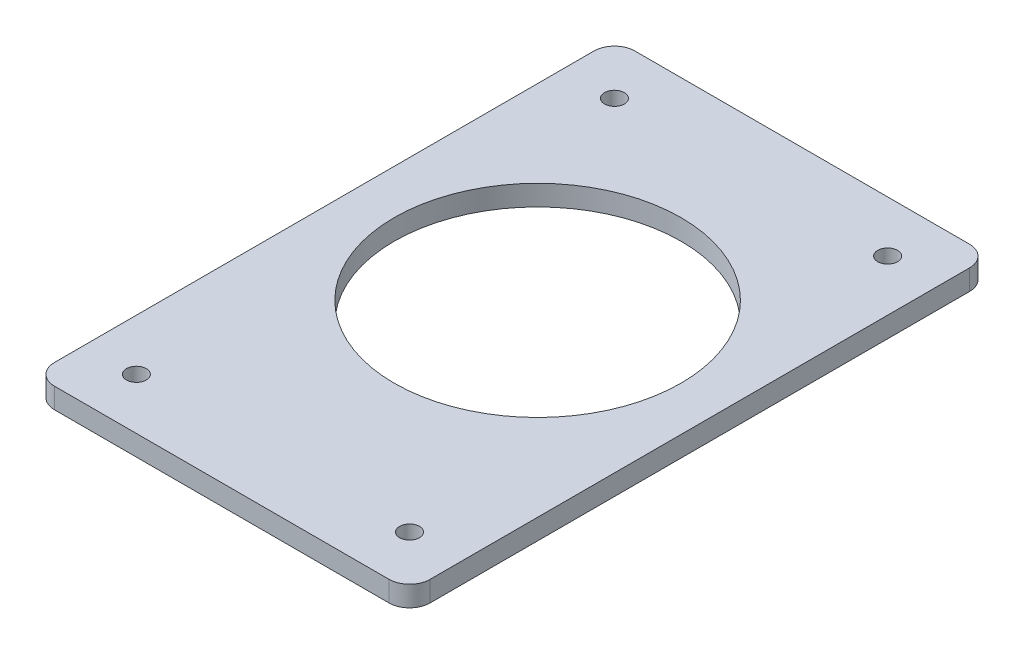
ISO-10303-21;
HEADER;
FILE_DESCRIPTION(('STEP AP214'),'2;1');
FILE_NAME('part.step','',(''),(''),'','','');
FILE_SCHEMA(('AUTOMOTIVE_DESIGN { 1 0 10303 214 1 1 1 1 }'));
ENDSEC;
DATA;
#1=APPLICATION_CONTEXT('core data for automotive mechanical design processes');
#2=APPLICATION_PROTOCOL_DEFINITION('international standard','automotive_design',2000,#1);
#3=PRODUCT_CONTEXT('',#1,'mechanical');
#4=PRODUCT('Part','Part','',(#3));
#5=PRODUCT_RELATED_PRODUCT_CATEGORY('part','',(#4));
#6=PRODUCT_DEFINITION_FORMATION('','',#4);
#7=PRODUCT_DEFINITION_CONTEXT('part definition',#1,'design');
#8=PRODUCT_DEFINITION('design','',#6,#7);
#9=PRODUCT_DEFINITION_SHAPE('','',#8);
#10=(LENGTH_UNIT() NAMED_UNIT(*) SI_UNIT(.MILLI.,.METRE.));
#11=(NAMED_UNIT(*) PLANE_ANGLE_UNIT() SI_UNIT($,.RADIAN.));
#12=(NAMED_UNIT(*) SI_UNIT($,.STERADIAN.) SOLID_ANGLE_UNIT());
#13=UNCERTAINTY_MEASURE_WITH_UNIT(LENGTH_MEASURE(1.E-05),#10,'distance_accuracy_value','');
#14=(GEOMETRIC_REPRESENTATION_CONTEXT(3) GLOBAL_UNCERTAINTY_ASSIGNED_CONTEXT((#13)) GLOBAL_UNIT_ASSIGNED_CONTEXT((#10,
#11,#12)) REPRESENTATION_CONTEXT('',''));
#15=CARTESIAN_POINT('',(0.,0.,0.));
#16=DIRECTION('',(0.,0.,1.));
#17=DIRECTION('',(1.,0.,0.));
#18=AXIS2_PLACEMENT_3D('',#15,#16,#17);
#19=CARTESIAN_POINT('',(0.,3.,0.));
#20=DIRECTION('',(0.,-1.,0.));
#21=DIRECTION('',(0.,0.,-1.));
#22=AXIS2_PLACEMENT_3D('',#19,#20,#21);
#23=PLANE('',#22);
#24=CARTESIAN_POINT('',(20.,3.,-31.25));
#25=DIRECTION('',(0.,1.,0.));
#26=DIRECTION('',(0.,0.,1.));
#27=AXIS2_PLACEMENT_3D('',#24,#25,#26);
#28=CIRCLE('',#27,1.45);
#29=CARTESIAN_POINT('',(20.,3.,-29.8));
#30=VERTEX_POINT('',#29);
#31=EDGE_CURVE('E230',#30,#30,#28,.T.);
#32=ORIENTED_EDGE('',*,*,#31,.F.);
#33=EDGE_LOOP('',(#32));
#34=FACE_BOUND('',#33,.T.);
#35=CARTESIAN_POINT('',(-20.,3.,38.75));
#36=DIRECTION('',(0.,1.,0.));
#37=DIRECTION('',(0.,0.,-1.));
#38=AXIS2_PLACEMENT_3D('',#35,#36,#37);
#39=CIRCLE('',#38,1.45);
#40=CARTESIAN_POINT('',(-20.,3.,37.3));
#41=VERTEX_POINT('',#40);
#42=EDGE_CURVE('E238',#41,#41,#39,.T.);
#43=ORIENTED_EDGE('',*,*,#42,.F.);
#44=EDGE_LOOP('',(#43));
#45=FACE_BOUND('',#44,.T.);
#46=CARTESIAN_POINT('',(20.,3.,38.75));
#47=DIRECTION('',(0.,1.,0.));
#48=DIRECTION('',(0.,0.,-1.));
#49=AXIS2_PLACEMENT_3D('',#46,#47,#48);
#50=CIRCLE('',#49,1.45);
#51=CARTESIAN_POINT('',(20.,3.,37.3));
#52=VERTEX_POINT('',#51);
#53=EDGE_CURVE('E239',#52,#52,#50,.T.);
#54=ORIENTED_EDGE('',*,*,#53,.F.);
#55=EDGE_LOOP('',(#54));
#56=FACE_BOUND('',#55,.T.);
#57=CARTESIAN_POINT('',(-20.,3.,-31.25));
#58=DIRECTION('',(0.,1.,0.));
#59=DIRECTION('',(0.,0.,1.));
#60=AXIS2_PLACEMENT_3D('',#57,#58,#59);
#61=CIRCLE('',#60,1.45);
#62=CARTESIAN_POINT('',(-20.,3.,-29.8));
#63=VERTEX_POINT('',#62);
#64=EDGE_CURVE('E226',#63,#63,#61,.T.);
#65=ORIENTED_EDGE('',*,*,#64,.F.);
#66=EDGE_LOOP('',(#65));
#67=FACE_BOUND('',#66,.T.);
#68=DIRECTION('',(1.,0.,0.));
#69=VECTOR('',#68,1.);
#70=CARTESIAN_POINT('',(-27.5,3.,46.25));
#71=LINE('',#70,#69);
#72=CARTESIAN_POINT('',(-24.5,3.,46.25));
#73=VERTEX_POINT('',#72);
#74=CARTESIAN_POINT('',(24.5,3.,46.25));
#75=VERTEX_POINT('',#74);
#76=EDGE_CURVE('E156',#73,#75,#71,.T.);
#77=ORIENTED_EDGE('',*,*,#76,.T.);
#78=CARTESIAN_POINT('',(24.5,3.,43.25));
#79=DIRECTION('',(0.,-1.,0.));
#80=DIRECTION('',(0.,0.,-1.));
#81=AXIS2_PLACEMENT_3D('',#78,#79,#80);
#82=CIRCLE('',#81,3.);
#83=CARTESIAN_POINT('',(27.5,3.,43.25));
#84=VERTEX_POINT('',#83);
#85=EDGE_CURVE('E185',#75,#84,#82,.F.);
#86=ORIENTED_EDGE('',*,*,#85,.T.);
#87=DIRECTION('',(0.,0.,-1.));
#88=VECTOR('',#87,1.);
#89=CARTESIAN_POINT('',(27.5,3.,46.25));
#90=LINE('',#89,#88);
#91=CARTESIAN_POINT('',(27.5,3.,-35.75));
#92=VERTEX_POINT('',#91);
#93=EDGE_CURVE('E134',#84,#92,#90,.T.);
#94=ORIENTED_EDGE('',*,*,#93,.T.);
#95=CARTESIAN_POINT('',(24.5,3.,-35.75));
#96=DIRECTION('',(0.,-1.,0.));
#97=DIRECTION('',(0.,0.,-1.));
#98=AXIS2_PLACEMENT_3D('',#95,#96,#97);
#99=CIRCLE('',#98,3.);
#100=CARTESIAN_POINT('',(24.5,3.,-38.75));
#101=VERTEX_POINT('',#100);
#102=EDGE_CURVE('E179',#92,#101,#99,.F.);
#103=ORIENTED_EDGE('',*,*,#102,.T.);
#104=DIRECTION('',(-1.,0.,0.));
#105=VECTOR('',#104,1.);
#106=CARTESIAN_POINT('',(-27.5,3.,-38.75));
#107=LINE('',#106,#105);
#108=CARTESIAN_POINT('',(-24.5,3.,-38.75));
#109=VERTEX_POINT('',#108);
#110=EDGE_CURVE('E198',#101,#109,#107,.T.);
#111=ORIENTED_EDGE('',*,*,#110,.T.);
#112=CARTESIAN_POINT('',(-24.5,3.,-35.75));
#113=DIRECTION('',(0.,-1.,0.));
#114=DIRECTION('',(0.,0.,-1.));
#115=AXIS2_PLACEMENT_3D('',#112,#113,#114);
#116=CIRCLE('',#115,3.);
#117=CARTESIAN_POINT('',(-27.5,3.,-35.75));
#118=VERTEX_POINT('',#117);
#119=EDGE_CURVE('E68',#109,#118,#116,.F.);
#120=ORIENTED_EDGE('',*,*,#119,.T.);
#121=DIRECTION('',(0.,0.,1.));
#122=VECTOR('',#121,1.);
#123=CARTESIAN_POINT('',(-27.5,3.,46.25));
#124=LINE('',#123,#122);
#125=CARTESIAN_POINT('',(-27.5,3.,43.25));
#126=VERTEX_POINT('',#125);
#127=EDGE_CURVE('E205',#118,#126,#124,.T.);
#128=ORIENTED_EDGE('',*,*,#127,.T.);
#129=CARTESIAN_POINT('',(-24.5,3.,43.25));
#130=DIRECTION('',(0.,-1.,0.));
#131=DIRECTION('',(0.,0.,-1.));
#132=AXIS2_PLACEMENT_3D('',#129,#130,#131);
#133=CIRCLE('',#132,3.);
#134=EDGE_CURVE('E182',#126,#73,#133,.F.);
#135=ORIENTED_EDGE('',*,*,#134,.T.);
#136=EDGE_LOOP('',(#77,#86,#94,#103,#111,#120,#128,#135));
#137=FACE_BOUND('',#136,.T.);
#138=CARTESIAN_POINT('',(0.,3.,0.));
#139=DIRECTION('',(0.,1.,0.));
#140=DIRECTION('',(0.,0.,1.));
#141=AXIS2_PLACEMENT_3D('',#138,#139,#140);
#142=CIRCLE('',#141,21.);
#143=CARTESIAN_POINT('',(0.,3.,21.));
#144=VERTEX_POINT('',#143);
#145=EDGE_CURVE('E145',#144,#144,#142,.T.);
#146=ORIENTED_EDGE('',*,*,#145,.F.);
#147=EDGE_LOOP('',(#146));
#148=FACE_BOUND('',#147,.T.);
#149=ADVANCED_FACE('F45',(#34,#45,#56,#67,#137,#148),#23,.F.);
#150=CARTESIAN_POINT('',(0.,0.,0.));
#151=DIRECTION('',(0.,-1.,0.));
#152=DIRECTION('',(0.,0.,-1.));
#153=AXIS2_PLACEMENT_3D('',#150,#151,#152);
#154=PLANE('',#153);
#155=CARTESIAN_POINT('',(20.,0.,-31.25));
#156=DIRECTION('',(0.,1.,0.));
#157=DIRECTION('',(0.,0.,1.));
#158=AXIS2_PLACEMENT_3D('',#155,#156,#157);
#159=CIRCLE('',#158,1.45);
#160=CARTESIAN_POINT('',(20.,0.,-29.8));
#161=VERTEX_POINT('',#160);
#162=EDGE_CURVE('E243',#161,#161,#159,.T.);
#163=ORIENTED_EDGE('',*,*,#162,.T.);
#164=EDGE_LOOP('',(#163));
#165=FACE_BOUND('',#164,.T.);
#166=CARTESIAN_POINT('',(-20.,0.,38.75));
#167=DIRECTION('',(0.,1.,0.));
#168=DIRECTION('',(0.,0.,-1.));
#169=AXIS2_PLACEMENT_3D('',#166,#167,#168);
#170=CIRCLE('',#169,1.45);
#171=CARTESIAN_POINT('',(-20.,0.,37.3));
#172=VERTEX_POINT('',#171);
#173=EDGE_CURVE('E234',#172,#172,#170,.T.);
#174=ORIENTED_EDGE('',*,*,#173,.T.);
#175=EDGE_LOOP('',(#174));
#176=FACE_BOUND('',#175,.T.);
#177=CARTESIAN_POINT('',(20.,0.,38.75));
#178=DIRECTION('',(0.,1.,0.));
#179=DIRECTION('',(0.,0.,-1.));
#180=AXIS2_PLACEMENT_3D('',#177,#178,#179);
#181=CIRCLE('',#180,1.45);
#182=CARTESIAN_POINT('',(20.,0.,37.3));
#183=VERTEX_POINT('',#182);
#184=EDGE_CURVE('E250',#183,#183,#181,.T.);
#185=ORIENTED_EDGE('',*,*,#184,.T.);
#186=EDGE_LOOP('',(#185));
#187=FACE_BOUND('',#186,.T.);
#188=CARTESIAN_POINT('',(-20.,0.,-31.25));
#189=DIRECTION('',(0.,1.,0.));
#190=DIRECTION('',(0.,0.,1.));
#191=AXIS2_PLACEMENT_3D('',#188,#189,#190);
#192=CIRCLE('',#191,1.45);
#193=CARTESIAN_POINT('',(-20.,0.,-29.8));
#194=VERTEX_POINT('',#193);
#195=EDGE_CURVE('E224',#194,#194,#192,.T.);
#196=ORIENTED_EDGE('',*,*,#195,.T.);
#197=EDGE_LOOP('',(#196));
#198=FACE_BOUND('',#197,.T.);
#199=DIRECTION('',(0.,0.,-1.));
#200=VECTOR('',#199,1.);
#201=CARTESIAN_POINT('',(27.5,0.,46.25));
#202=LINE('',#201,#200);
#203=CARTESIAN_POINT('',(27.5,0.,43.25));
#204=VERTEX_POINT('',#203);
#205=CARTESIAN_POINT('',(27.5,0.,-35.75));
#206=VERTEX_POINT('',#205);
#207=EDGE_CURVE('E131',#204,#206,#202,.T.);
#208=ORIENTED_EDGE('',*,*,#207,.F.);
#209=CARTESIAN_POINT('',(24.5,0.,43.25));
#210=DIRECTION('',(0.,-1.,0.));
#211=DIRECTION('',(0.,0.,-1.));
#212=AXIS2_PLACEMENT_3D('',#209,#210,#211);
#213=CIRCLE('',#212,3.);
#214=CARTESIAN_POINT('',(24.5,0.,46.25));
#215=VERTEX_POINT('',#214);
#216=EDGE_CURVE('E113',#204,#215,#213,.T.);
#217=ORIENTED_EDGE('',*,*,#216,.T.);
#218=DIRECTION('',(1.,0.,0.));
#219=VECTOR('',#218,1.);
#220=CARTESIAN_POINT('',(-27.5,0.,46.25));
#221=LINE('',#220,#219);
#222=CARTESIAN_POINT('',(-24.5,0.,46.25));
#223=VERTEX_POINT('',#222);
#224=EDGE_CURVE('E161',#223,#215,#221,.T.);
#225=ORIENTED_EDGE('',*,*,#224,.F.);
#226=CARTESIAN_POINT('',(-24.5,0.,43.25));
#227=DIRECTION('',(0.,-1.,0.));
#228=DIRECTION('',(0.,0.,-1.));
#229=AXIS2_PLACEMENT_3D('',#226,#227,#228);
#230=CIRCLE('',#229,3.);
#231=CARTESIAN_POINT('',(-27.5,0.,43.25));
#232=VERTEX_POINT('',#231);
#233=EDGE_CURVE('E125',#223,#232,#230,.T.);
#234=ORIENTED_EDGE('',*,*,#233,.T.);
#235=DIRECTION('',(0.,0.,1.));
#236=VECTOR('',#235,1.);
#237=CARTESIAN_POINT('',(-27.5,0.,46.25));
#238=LINE('',#237,#236);
#239=CARTESIAN_POINT('',(-27.5,0.,-35.75));
#240=VERTEX_POINT('',#239);
#241=EDGE_CURVE('E150',#240,#232,#238,.T.);
#242=ORIENTED_EDGE('',*,*,#241,.F.);
#243=CARTESIAN_POINT('',(-24.5,0.,-35.75));
#244=DIRECTION('',(0.,-1.,0.));
#245=DIRECTION('',(0.,0.,-1.));
#246=AXIS2_PLACEMENT_3D('',#243,#244,#245);
#247=CIRCLE('',#246,3.);
#248=CARTESIAN_POINT('',(-24.5,0.,-38.75));
#249=VERTEX_POINT('',#248);
#250=EDGE_CURVE('E136',#240,#249,#247,.T.);
#251=ORIENTED_EDGE('',*,*,#250,.T.);
#252=DIRECTION('',(-1.,0.,0.));
#253=VECTOR('',#252,1.);
#254=CARTESIAN_POINT('',(-27.5,0.,-38.75));
#255=LINE('',#254,#253);
#256=CARTESIAN_POINT('',(24.5,0.,-38.75));
#257=VERTEX_POINT('',#256);
#258=EDGE_CURVE('E144',#257,#249,#255,.T.);
#259=ORIENTED_EDGE('',*,*,#258,.F.);
#260=CARTESIAN_POINT('',(24.5,0.,-35.75));
#261=DIRECTION('',(0.,-1.,0.));
#262=DIRECTION('',(0.,0.,-1.));
#263=AXIS2_PLACEMENT_3D('',#260,#261,#262);
#264=CIRCLE('',#263,3.);
#265=EDGE_CURVE('E142',#257,#206,#264,.T.);
#266=ORIENTED_EDGE('',*,*,#265,.T.);
#267=EDGE_LOOP('',(#208,#217,#225,#234,#242,#251,#259,#266));
#268=FACE_BOUND('',#267,.T.);
#269=CARTESIAN_POINT('',(0.,0.,0.));
#270=DIRECTION('',(0.,1.,0.));
#271=DIRECTION('',(0.,0.,1.));
#272=AXIS2_PLACEMENT_3D('',#269,#270,#271);
#273=CIRCLE('',#272,21.);
#274=CARTESIAN_POINT('',(0.,0.,21.));
#275=VERTEX_POINT('',#274);
#276=EDGE_CURVE('E153',#275,#275,#273,.T.);
#277=ORIENTED_EDGE('',*,*,#276,.T.);
#278=EDGE_LOOP('',(#277));
#279=FACE_BOUND('',#278,.T.);
#280=ADVANCED_FACE('F139',(#165,#176,#187,#198,#268,#279),#154,.T.);
#281=CARTESIAN_POINT('',(27.5,3.,46.25));
#282=DIRECTION('',(-1.,0.,0.));
#283=DIRECTION('',(0.,0.,1.));
#284=AXIS2_PLACEMENT_3D('',#281,#282,#283);
#285=PLANE('',#284);
#286=ORIENTED_EDGE('',*,*,#93,.F.);
#287=DIRECTION('',(0.,-1.,0.));
#288=VECTOR('',#287,1.);
#289=CARTESIAN_POINT('',(27.5,3.,43.25));
#290=LINE('',#289,#288);
#291=EDGE_CURVE('E117',#84,#204,#290,.T.);
#292=ORIENTED_EDGE('',*,*,#291,.T.);
#293=ORIENTED_EDGE('',*,*,#207,.T.);
#294=DIRECTION('',(0.,-1.,0.));
#295=VECTOR('',#294,1.);
#296=CARTESIAN_POINT('',(27.5,3.,-35.75));
#297=LINE('',#296,#295);
#298=EDGE_CURVE('E137',#206,#92,#297,.F.);
#299=ORIENTED_EDGE('',*,*,#298,.T.);
#300=EDGE_LOOP('',(#286,#292,#293,#299));
#301=FACE_BOUND('',#300,.T.);
#302=ADVANCED_FACE('F130',(#301),#285,.F.);
#303=CARTESIAN_POINT('',(-27.5,3.,-38.75));
#304=DIRECTION('',(0.,0.,1.));
#305=DIRECTION('',(1.,0.,0.));
#306=AXIS2_PLACEMENT_3D('',#303,#304,#305);
#307=PLANE('',#306);
#308=ORIENTED_EDGE('',*,*,#110,.F.);
#309=DIRECTION('',(0.,-1.,0.));
#310=VECTOR('',#309,1.);
#311=CARTESIAN_POINT('',(24.5,3.,-38.75));
#312=LINE('',#311,#310);
#313=EDGE_CURVE('E11',#101,#257,#312,.T.);
#314=ORIENTED_EDGE('',*,*,#313,.T.);
#315=ORIENTED_EDGE('',*,*,#258,.T.);
#316=DIRECTION('',(0.,-1.,0.));
#317=VECTOR('',#316,1.);
#318=CARTESIAN_POINT('',(-24.5,3.,-38.75));
#319=LINE('',#318,#317);
#320=EDGE_CURVE('E54',#249,#109,#319,.F.);
#321=ORIENTED_EDGE('',*,*,#320,.T.);
#322=EDGE_LOOP('',(#308,#314,#315,#321));
#323=FACE_BOUND('',#322,.T.);
#324=ADVANCED_FACE('F197',(#323),#307,.F.);
#325=CARTESIAN_POINT('',(-27.5,3.,46.25));
#326=DIRECTION('',(1.,0.,0.));
#327=DIRECTION('',(0.,0.,-1.));
#328=AXIS2_PLACEMENT_3D('',#325,#326,#327);
#329=PLANE('',#328);
#330=ORIENTED_EDGE('',*,*,#241,.T.);
#331=DIRECTION('',(0.,-1.,0.));
#332=VECTOR('',#331,1.);
#333=CARTESIAN_POINT('',(-27.5,3.,43.25));
#334=LINE('',#333,#332);
#335=EDGE_CURVE('E61',#232,#126,#334,.F.);
#336=ORIENTED_EDGE('',*,*,#335,.T.);
#337=ORIENTED_EDGE('',*,*,#127,.F.);
#338=DIRECTION('',(0.,-1.,0.));
#339=VECTOR('',#338,1.);
#340=CARTESIAN_POINT('',(-27.5,3.,-35.75));
#341=LINE('',#340,#339);
#342=EDGE_CURVE('E188',#118,#240,#341,.T.);
#343=ORIENTED_EDGE('',*,*,#342,.T.);
#344=EDGE_LOOP('',(#330,#336,#337,#343));
#345=FACE_BOUND('',#344,.T.);
#346=ADVANCED_FACE('F209',(#345),#329,.F.);
#347=CARTESIAN_POINT('',(-27.5,3.,46.25));
#348=DIRECTION('',(0.,0.,-1.));
#349=DIRECTION('',(-1.,0.,0.));
#350=AXIS2_PLACEMENT_3D('',#347,#348,#349);
#351=PLANE('',#350);
#352=ORIENTED_EDGE('',*,*,#224,.T.);
#353=DIRECTION('',(0.,-1.,0.));
#354=VECTOR('',#353,1.);
#355=CARTESIAN_POINT('',(24.5,3.,46.25));
#356=LINE('',#355,#354);
#357=EDGE_CURVE('E118',#215,#75,#356,.F.);
#358=ORIENTED_EDGE('',*,*,#357,.T.);
#359=ORIENTED_EDGE('',*,*,#76,.F.);
#360=DIRECTION('',(0.,-1.,0.));
#361=VECTOR('',#360,1.);
#362=CARTESIAN_POINT('',(-24.5,3.,46.25));
#363=LINE('',#362,#361);
#364=EDGE_CURVE('E124',#73,#223,#363,.T.);
#365=ORIENTED_EDGE('',*,*,#364,.T.);
#366=EDGE_LOOP('',(#352,#358,#359,#365));
#367=FACE_BOUND('',#366,.T.);
#368=ADVANCED_FACE('F216',(#367),#351,.F.);
#369=CARTESIAN_POINT('',(0.,3.,0.));
#370=DIRECTION('',(0.,-1.,0.));
#371=DIRECTION('',(0.,0.,-1.));
#372=AXIS2_PLACEMENT_3D('',#369,#370,#371);
#373=CYLINDRICAL_SURFACE('',#372,21.);
#374=ORIENTED_EDGE('',*,*,#145,.T.);
#375=EDGE_LOOP('',(#374));
#376=FACE_BOUND('',#375,.T.);
#377=ORIENTED_EDGE('',*,*,#276,.F.);
#378=EDGE_LOOP('',(#377));
#379=FACE_BOUND('',#378,.T.);
#380=ADVANCED_FACE('F268',(#376,#379),#373,.F.);
#381=CARTESIAN_POINT('',(-20.,0.,-31.25));
#382=DIRECTION('',(0.,1.,0.));
#383=DIRECTION('',(0.,0.,1.));
#384=AXIS2_PLACEMENT_3D('',#381,#382,#383);
#385=CYLINDRICAL_SURFACE('',#384,1.45);
#386=ORIENTED_EDGE('',*,*,#195,.F.);
#387=EDGE_LOOP('',(#386));
#388=FACE_BOUND('',#387,.T.);
#389=ORIENTED_EDGE('',*,*,#64,.T.);
#390=EDGE_LOOP('',(#389));
#391=FACE_BOUND('',#390,.T.);
#392=ADVANCED_FACE('F266',(#388,#391),#385,.F.);
#393=CARTESIAN_POINT('',(20.,0.,38.75));
#394=DIRECTION('',(0.,1.,0.));
#395=DIRECTION('',(0.,0.,1.));
#396=AXIS2_PLACEMENT_3D('',#393,#394,#395);
#397=CYLINDRICAL_SURFACE('',#396,1.45);
#398=ORIENTED_EDGE('',*,*,#184,.F.);
#399=EDGE_LOOP('',(#398));
#400=FACE_BOUND('',#399,.T.);
#401=ORIENTED_EDGE('',*,*,#53,.T.);
#402=EDGE_LOOP('',(#401));
#403=FACE_BOUND('',#402,.T.);
#404=ADVANCED_FACE('F258',(#400,#403),#397,.F.);
#405=CARTESIAN_POINT('',(-20.,0.,38.75));
#406=DIRECTION('',(0.,1.,0.));
#407=DIRECTION('',(0.,0.,1.));
#408=AXIS2_PLACEMENT_3D('',#405,#406,#407);
#409=CYLINDRICAL_SURFACE('',#408,1.45);
#410=ORIENTED_EDGE('',*,*,#173,.F.);
#411=EDGE_LOOP('',(#410));
#412=FACE_BOUND('',#411,.T.);
#413=ORIENTED_EDGE('',*,*,#42,.T.);
#414=EDGE_LOOP('',(#413));
#415=FACE_BOUND('',#414,.T.);
#416=ADVANCED_FACE('F275',(#412,#415),#409,.F.);
#417=CARTESIAN_POINT('',(20.,0.,-31.25));
#418=DIRECTION('',(0.,1.,0.));
#419=DIRECTION('',(0.,0.,1.));
#420=AXIS2_PLACEMENT_3D('',#417,#418,#419);
#421=CYLINDRICAL_SURFACE('',#420,1.45);
#422=ORIENTED_EDGE('',*,*,#162,.F.);
#423=EDGE_LOOP('',(#422));
#424=FACE_BOUND('',#423,.T.);
#425=ORIENTED_EDGE('',*,*,#31,.T.);
#426=EDGE_LOOP('',(#425));
#427=FACE_BOUND('',#426,.T.);
#428=ADVANCED_FACE('F297',(#424,#427),#421,.F.);
#429=CARTESIAN_POINT('',(24.5,3.,43.25));
#430=DIRECTION('',(0.,-1.,0.));
#431=DIRECTION('',(0.,0.,-1.));
#432=AXIS2_PLACEMENT_3D('',#429,#430,#431);
#433=CYLINDRICAL_SURFACE('',#432,3.);
#434=ORIENTED_EDGE('',*,*,#85,.F.);
#435=ORIENTED_EDGE('',*,*,#357,.F.);
#436=ORIENTED_EDGE('',*,*,#216,.F.);
#437=ORIENTED_EDGE('',*,*,#291,.F.);
#438=EDGE_LOOP('',(#434,#435,#436,#437));
#439=FACE_BOUND('',#438,.T.);
#440=ADVANCED_FACE('F116',(#439),#433,.T.);
#441=CARTESIAN_POINT('',(-24.5,3.,43.25));
#442=DIRECTION('',(0.,-1.,0.));
#443=DIRECTION('',(0.,0.,-1.));
#444=AXIS2_PLACEMENT_3D('',#441,#442,#443);
#445=CYLINDRICAL_SURFACE('',#444,3.);
#446=ORIENTED_EDGE('',*,*,#134,.F.);
#447=ORIENTED_EDGE('',*,*,#335,.F.);
#448=ORIENTED_EDGE('',*,*,#233,.F.);
#449=ORIENTED_EDGE('',*,*,#364,.F.);
#450=EDGE_LOOP('',(#446,#447,#448,#449));
#451=FACE_BOUND('',#450,.T.);
#452=ADVANCED_FACE('F213',(#451),#445,.T.);
#453=CARTESIAN_POINT('',(24.5,3.,-35.75));
#454=DIRECTION('',(0.,-1.,0.));
#455=DIRECTION('',(0.,0.,-1.));
#456=AXIS2_PLACEMENT_3D('',#453,#454,#455);
#457=CYLINDRICAL_SURFACE('',#456,3.);
#458=ORIENTED_EDGE('',*,*,#102,.F.);
#459=ORIENTED_EDGE('',*,*,#298,.F.);
#460=ORIENTED_EDGE('',*,*,#265,.F.);
#461=ORIENTED_EDGE('',*,*,#313,.F.);
#462=EDGE_LOOP('',(#458,#459,#460,#461));
#463=FACE_BOUND('',#462,.T.);
#464=ADVANCED_FACE('F299',(#463),#457,.T.);
#465=CARTESIAN_POINT('',(-24.5,3.,-35.75));
#466=DIRECTION('',(0.,-1.,0.));
#467=DIRECTION('',(0.,0.,-1.));
#468=AXIS2_PLACEMENT_3D('',#465,#466,#467);
#469=CYLINDRICAL_SURFACE('',#468,3.);
#470=ORIENTED_EDGE('',*,*,#119,.F.);
#471=ORIENTED_EDGE('',*,*,#320,.F.);
#472=ORIENTED_EDGE('',*,*,#250,.F.);
#473=ORIENTED_EDGE('',*,*,#342,.F.);
#474=EDGE_LOOP('',(#470,#471,#472,#473));
#475=FACE_BOUND('',#474,.T.);
#476=ADVANCED_FACE('F47',(#475),#469,.T.);
#477=CLOSED_SHELL('',(#149,#280,#302,#324,#346,#368,#380,#392,#404,#416,#428,#440,#452,#464,#476));
#478=MANIFOLD_SOLID_BREP('B2',#477);
#479=ADVANCED_BREP_SHAPE_REPRESENTATION('',(#18,#478),#14);
#480=SHAPE_DEFINITION_REPRESENTATION(#9,#479);
ENDSEC;
END-ISO-10303-21;
